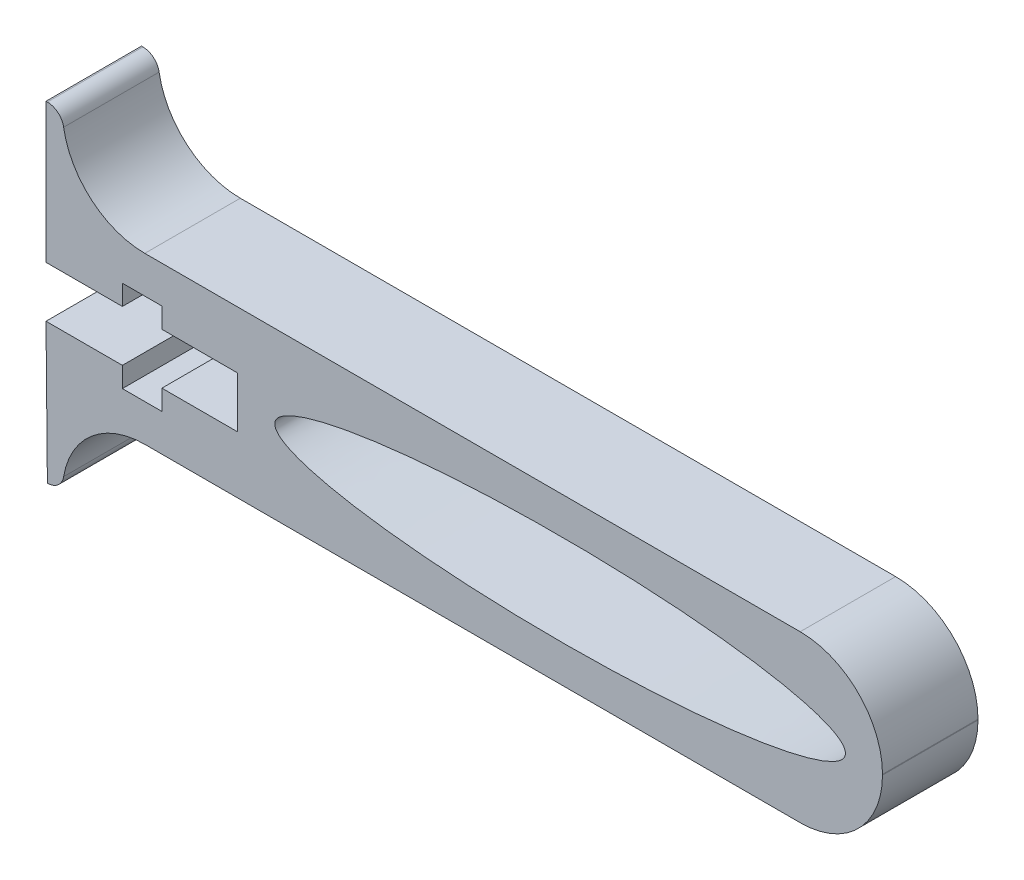
ISO-10303-21;
HEADER;
FILE_DESCRIPTION(('STEP AP214'),'2;1');
FILE_NAME('part.step','',(''),(''),'','','');
FILE_SCHEMA(('AUTOMOTIVE_DESIGN { 1 0 10303 214 1 1 1 1 }'));
ENDSEC;
DATA;
#1=APPLICATION_CONTEXT('core data for automotive mechanical design processes');
#2=APPLICATION_PROTOCOL_DEFINITION('international standard','automotive_design',2000,#1);
#3=PRODUCT_CONTEXT('',#1,'mechanical');
#4=PRODUCT('Part','Part','',(#3));
#5=PRODUCT_RELATED_PRODUCT_CATEGORY('part','',(#4));
#6=PRODUCT_DEFINITION_FORMATION('','',#4);
#7=PRODUCT_DEFINITION_CONTEXT('part definition',#1,'design');
#8=PRODUCT_DEFINITION('design','',#6,#7);
#9=PRODUCT_DEFINITION_SHAPE('','',#8);
#10=(LENGTH_UNIT() NAMED_UNIT(*) SI_UNIT(.MILLI.,.METRE.));
#11=(NAMED_UNIT(*) PLANE_ANGLE_UNIT() SI_UNIT($,.RADIAN.));
#12=(NAMED_UNIT(*) SI_UNIT($,.STERADIAN.) SOLID_ANGLE_UNIT());
#13=UNCERTAINTY_MEASURE_WITH_UNIT(LENGTH_MEASURE(1.E-05),#10,'distance_accuracy_value','');
#14=(GEOMETRIC_REPRESENTATION_CONTEXT(3) GLOBAL_UNCERTAINTY_ASSIGNED_CONTEXT((#13)) GLOBAL_UNIT_ASSIGNED_CONTEXT((#10,
#11,#12)) REPRESENTATION_CONTEXT('',''));
#15=CARTESIAN_POINT('',(0.,0.,0.));
#16=DIRECTION('',(0.,0.,1.));
#17=DIRECTION('',(1.,0.,0.));
#18=AXIS2_PLACEMENT_3D('',#15,#16,#17);
#19=CARTESIAN_POINT('',(-17.0141354369794,35.6066821471283,5.8));
#20=DIRECTION('',(0.,0.,-1.));
#21=DIRECTION('',(-1.,0.,0.));
#22=AXIS2_PLACEMENT_3D('',#19,#20,#21);
#23=PLANE('',#22);
#24=DIRECTION('',(0.,1.,0.));
#25=VECTOR('',#24,1.);
#26=CARTESIAN_POINT('',(-12.4598506262596,29.3566821471283,5.8));
#27=LINE('',#26,#25);
#28=CARTESIAN_POINT('',(-12.4598506262596,28.1322801349897,5.8));
#29=VERTEX_POINT('',#28);
#30=CARTESIAN_POINT('',(-12.4598506262596,29.3566821471283,5.8));
#31=VERTEX_POINT('',#30);
#32=EDGE_CURVE('E264',#29,#31,#27,.T.);
#33=ORIENTED_EDGE('',*,*,#32,.T.);
#34=DIRECTION('',(1.,0.,0.));
#35=VECTOR('',#34,1.);
#36=CARTESIAN_POINT('',(-10.0598506262596,29.3566821471283,5.8));
#37=LINE('',#36,#35);
#38=CARTESIAN_POINT('',(-10.0598506262596,29.3566821471283,5.8));
#39=VERTEX_POINT('',#38);
#40=EDGE_CURVE('E137',#31,#39,#37,.T.);
#41=ORIENTED_EDGE('',*,*,#40,.T.);
#42=DIRECTION('',(0.,-1.,0.));
#43=VECTOR('',#42,1.);
#44=CARTESIAN_POINT('',(-10.0598506262596,29.3566821471283,5.8));
#45=LINE('',#44,#43);
#46=CARTESIAN_POINT('',(-10.0598506262596,28.1322801349897,5.8));
#47=VERTEX_POINT('',#46);
#48=EDGE_CURVE('E324',#39,#47,#45,.T.);
#49=ORIENTED_EDGE('',*,*,#48,.T.);
#50=DIRECTION('',(1.,0.,0.));
#51=VECTOR('',#50,1.);
#52=CARTESIAN_POINT('',(-10.0598506262596,28.1322801349897,5.8));
#53=LINE('',#52,#51);
#54=CARTESIAN_POINT('',(-5.45496555029504,28.1322801349897,5.8));
#55=VERTEX_POINT('',#54);
#56=EDGE_CURVE('E343',#47,#55,#53,.T.);
#57=ORIENTED_EDGE('',*,*,#56,.T.);
#58=DIRECTION('',(0.,-1.,0.));
#59=VECTOR('',#58,1.);
#60=CARTESIAN_POINT('',(-5.45496555029504,25.0366001234286,5.8));
#61=LINE('',#60,#59);
#62=CARTESIAN_POINT('',(-5.45496555029504,25.0366001234286,5.8));
#63=VERTEX_POINT('',#62);
#64=EDGE_CURVE('E340',#55,#63,#61,.T.);
#65=ORIENTED_EDGE('',*,*,#64,.T.);
#66=DIRECTION('',(-1.,0.,0.));
#67=VECTOR('',#66,1.);
#68=CARTESIAN_POINT('',(-10.0598506262596,25.0366001234286,5.8));
#69=LINE('',#68,#67);
#70=CARTESIAN_POINT('',(-10.0598506262596,25.0366001234286,5.8));
#71=VERTEX_POINT('',#70);
#72=EDGE_CURVE('E342',#63,#71,#69,.T.);
#73=ORIENTED_EDGE('',*,*,#72,.T.);
#74=DIRECTION('',(0.,-1.,0.));
#75=VECTOR('',#74,1.);
#76=CARTESIAN_POINT('',(-10.0598506262596,25.0366001234286,5.8));
#77=LINE('',#76,#75);
#78=CARTESIAN_POINT('',(-10.0598506262596,23.8121981112899,5.8));
#79=VERTEX_POINT('',#78);
#80=EDGE_CURVE('E345',#71,#79,#77,.T.);
#81=ORIENTED_EDGE('',*,*,#80,.T.);
#82=DIRECTION('',(-1.,0.,0.));
#83=VECTOR('',#82,1.);
#84=CARTESIAN_POINT('',(-10.0598506262596,23.8121981112899,5.8));
#85=LINE('',#84,#83);
#86=CARTESIAN_POINT('',(-12.4598506262596,23.8121981112899,5.8));
#87=VERTEX_POINT('',#86);
#88=EDGE_CURVE('E351',#79,#87,#85,.T.);
#89=ORIENTED_EDGE('',*,*,#88,.T.);
#90=DIRECTION('',(0.,1.,0.));
#91=VECTOR('',#90,1.);
#92=CARTESIAN_POINT('',(-12.4598506262596,25.0366001234286,5.8));
#93=LINE('',#92,#91);
#94=CARTESIAN_POINT('',(-12.4598506262596,25.0366001234286,5.8));
#95=VERTEX_POINT('',#94);
#96=EDGE_CURVE('E353',#87,#95,#93,.T.);
#97=ORIENTED_EDGE('',*,*,#96,.T.);
#98=DIRECTION('',(-1.,0.,0.));
#99=VECTOR('',#98,1.);
#100=CARTESIAN_POINT('',(-12.4598506262596,25.0366001234286,5.8));
#101=LINE('',#100,#99);
#102=CARTESIAN_POINT('',(-17.0980556538798,25.0366001234286,5.8));
#103=VERTEX_POINT('',#102);
#104=EDGE_CURVE('E355',#95,#103,#101,.T.);
#105=ORIENTED_EDGE('',*,*,#104,.T.);
#106=DIRECTION('',(0.00990230369705596,-0.999950970988824,0.));
#107=VECTOR('',#106,1.);
#108=CARTESIAN_POINT('',(-17.0141354369794,16.5621981112899,5.8));
#109=LINE('',#108,#107);
#110=CARTESIAN_POINT('',(-17.0141354369794,16.5621981112899,5.8));
#111=VERTEX_POINT('',#110);
#112=EDGE_CURVE('E357',#103,#111,#109,.T.);
#113=ORIENTED_EDGE('',*,*,#112,.T.);
#114=CARTESIAN_POINT('',(-17.0141354369794,17.5621981112899,5.8));
#115=DIRECTION('',(0.,0.,1.));
#116=DIRECTION('',(1.,0.,0.));
#117=AXIS2_PLACEMENT_3D('',#114,#115,#116);
#118=CIRCLE('',#117,1.);
#119=CARTESIAN_POINT('',(-16.0281221397962,17.3955314446233,5.8));
#120=VERTEX_POINT('',#119);
#121=EDGE_CURVE('E359',#111,#120,#118,.T.);
#122=ORIENTED_EDGE('',*,*,#121,.T.);
#123=CARTESIAN_POINT('',(-11.0980556538798,16.5621981112899,5.8));
#124=DIRECTION('',(0.,0.,-1.));
#125=DIRECTION('',(-1.,0.,0.));
#126=AXIS2_PLACEMENT_3D('',#123,#124,#125);
#127=CIRCLE('',#126,5.);
#128=CARTESIAN_POINT('',(-11.0980556538798,21.56219811129,5.8));
#129=VERTEX_POINT('',#128);
#130=EDGE_CURVE('E361',#120,#129,#127,.T.);
#131=ORIENTED_EDGE('',*,*,#130,.T.);
#132=DIRECTION('',(1.,0.,0.));
#133=VECTOR('',#132,1.);
#134=CARTESIAN_POINT('',(28.7019443461202,21.56219811129,5.8));
#135=LINE('',#134,#133);
#136=CARTESIAN_POINT('',(28.7019443461202,21.56219811129,5.8));
#137=VERTEX_POINT('',#136);
#138=EDGE_CURVE('E363',#129,#137,#135,.T.);
#139=ORIENTED_EDGE('',*,*,#138,.T.);
#140=CARTESIAN_POINT('',(28.7019443461202,26.56219811129,5.8));
#141=DIRECTION('',(0.,0.,1.));
#142=DIRECTION('',(1.,0.,0.));
#143=AXIS2_PLACEMENT_3D('',#140,#141,#142);
#144=CIRCLE('',#143,4.99999999999999);
#145=CARTESIAN_POINT('',(33.7019443461202,26.56219811129,5.8));
#146=VERTEX_POINT('',#145);
#147=EDGE_CURVE('E365',#137,#146,#144,.T.);
#148=ORIENTED_EDGE('',*,*,#147,.T.);
#149=DIRECTION('',(0.,1.,0.));
#150=VECTOR('',#149,1.);
#151=CARTESIAN_POINT('',(33.7019443461202,26.6066821471283,5.8));
#152=LINE('',#151,#150);
#153=CARTESIAN_POINT('',(33.7019443461202,26.6066821471283,5.8));
#154=VERTEX_POINT('',#153);
#155=EDGE_CURVE('E367',#146,#154,#152,.T.);
#156=ORIENTED_EDGE('',*,*,#155,.T.);
#157=CARTESIAN_POINT('',(28.7019443461202,26.6066821471283,5.8));
#158=DIRECTION('',(0.,0.,1.));
#159=DIRECTION('',(-1.,0.,0.));
#160=AXIS2_PLACEMENT_3D('',#157,#158,#159);
#161=CIRCLE('',#160,4.99999999999999);
#162=CARTESIAN_POINT('',(28.7019443461202,31.6066821471283,5.8));
#163=VERTEX_POINT('',#162);
#164=EDGE_CURVE('E369',#154,#163,#161,.T.);
#165=ORIENTED_EDGE('',*,*,#164,.T.);
#166=DIRECTION('',(-1.,0.,0.));
#167=VECTOR('',#166,1.);
#168=CARTESIAN_POINT('',(-11.0980556538798,31.6066821471283,5.8));
#169=LINE('',#168,#167);
#170=CARTESIAN_POINT('',(-11.0980556538798,31.6066821471283,5.8));
#171=VERTEX_POINT('',#170);
#172=EDGE_CURVE('E371',#163,#171,#169,.T.);
#173=ORIENTED_EDGE('',*,*,#172,.T.);
#174=CARTESIAN_POINT('',(-11.0980556538798,36.6066821471283,5.8));
#175=DIRECTION('',(0.,0.,-1.));
#176=DIRECTION('',(1.,0.,0.));
#177=AXIS2_PLACEMENT_3D('',#174,#175,#176);
#178=CIRCLE('',#177,5.);
#179=CARTESIAN_POINT('',(-16.0281221397962,35.773348813795,5.8));
#180=VERTEX_POINT('',#179);
#181=EDGE_CURVE('E373',#171,#180,#178,.T.);
#182=ORIENTED_EDGE('',*,*,#181,.T.);
#183=CARTESIAN_POINT('',(-17.0141354369794,35.6066821471283,5.8));
#184=DIRECTION('',(0.,0.,1.));
#185=DIRECTION('',(-1.,0.,0.));
#186=AXIS2_PLACEMENT_3D('',#183,#184,#185);
#187=CIRCLE('',#186,1.);
#188=CARTESIAN_POINT('',(-17.0141354369794,36.6066821471283,5.8));
#189=VERTEX_POINT('',#188);
#190=EDGE_CURVE('E201',#180,#189,#187,.T.);
#191=ORIENTED_EDGE('',*,*,#190,.T.);
#192=DIRECTION('',(-1.,0.,0.));
#193=VECTOR('',#192,1.);
#194=CARTESIAN_POINT('',(-17.0980556538798,36.6066821471283,5.8));
#195=LINE('',#194,#193);
#196=CARTESIAN_POINT('',(-17.0980556538798,36.6066821471283,5.8));
#197=VERTEX_POINT('',#196);
#198=EDGE_CURVE('E195',#189,#197,#195,.T.);
#199=ORIENTED_EDGE('',*,*,#198,.T.);
#200=DIRECTION('',(0.,-1.,0.));
#201=VECTOR('',#200,1.);
#202=CARTESIAN_POINT('',(-17.0980556538798,28.1322801349897,5.8));
#203=LINE('',#202,#201);
#204=CARTESIAN_POINT('',(-17.0980556538798,28.1322801349897,5.8));
#205=VERTEX_POINT('',#204);
#206=EDGE_CURVE('E199',#197,#205,#203,.T.);
#207=ORIENTED_EDGE('',*,*,#206,.T.);
#208=DIRECTION('',(1.,0.,0.));
#209=VECTOR('',#208,1.);
#210=CARTESIAN_POINT('',(-17.0980556538798,28.1322801349897,5.8));
#211=LINE('',#210,#209);
#212=EDGE_CURVE('E49',#205,#29,#211,.T.);
#213=ORIENTED_EDGE('',*,*,#212,.T.);
#214=EDGE_LOOP('',(#33,#41,#49,#57,#65,#73,#81,#89,#97,#105,#113,#122,#131,#139,#148,#156,#165,
#173,#182,#191,#199,#207,#213));
#215=FACE_BOUND('',#214,.T.);
#216=CARTESIAN_POINT('',(14.1234893979126,26.5844401292091,5.8));
#217=DIRECTION('',(0.,0.,1.));
#218=DIRECTION('',(-1.,0.,0.));
#219=AXIS2_PLACEMENT_3D('',#216,#217,#218);
#220=ELLIPSE('',#219,17.3284549482076,2.7722420179192);
#221=CARTESIAN_POINT('',(-3.20496555029504,26.5844401292091,5.8));
#222=VERTEX_POINT('',#221);
#223=EDGE_CURVE('E223',#222,#222,#220,.T.);
#224=ORIENTED_EDGE('',*,*,#223,.F.);
#225=EDGE_LOOP('',(#224));
#226=FACE_BOUND('',#225,.T.);
#227=ADVANCED_FACE('F32',(#215,#226),#23,.F.);
#228=CARTESIAN_POINT('',(-17.0141354369794,35.6066821471283,0.));
#229=DIRECTION('',(0.,0.,-1.));
#230=DIRECTION('',(-1.,0.,0.));
#231=AXIS2_PLACEMENT_3D('',#228,#229,#230);
#232=PLANE('',#231);
#233=DIRECTION('',(0.,1.,0.));
#234=VECTOR('',#233,1.);
#235=CARTESIAN_POINT('',(-12.4598506262596,29.3566821471283,0.));
#236=LINE('',#235,#234);
#237=CARTESIAN_POINT('',(-12.4598506262596,28.1322801349897,0.));
#238=VERTEX_POINT('',#237);
#239=CARTESIAN_POINT('',(-12.4598506262596,29.3566821471283,0.));
#240=VERTEX_POINT('',#239);
#241=EDGE_CURVE('E219',#238,#240,#236,.T.);
#242=ORIENTED_EDGE('',*,*,#241,.F.);
#243=DIRECTION('',(1.,0.,0.));
#244=VECTOR('',#243,1.);
#245=CARTESIAN_POINT('',(-17.0980556538798,28.1322801349897,0.));
#246=LINE('',#245,#244);
#247=CARTESIAN_POINT('',(-17.0980556538798,28.1322801349897,0.));
#248=VERTEX_POINT('',#247);
#249=EDGE_CURVE('E129',#248,#238,#246,.T.);
#250=ORIENTED_EDGE('',*,*,#249,.F.);
#251=DIRECTION('',(0.,-1.,0.));
#252=VECTOR('',#251,1.);
#253=CARTESIAN_POINT('',(-17.0980556538798,28.1322801349897,0.));
#254=LINE('',#253,#252);
#255=CARTESIAN_POINT('',(-17.0980556538798,36.6066821471283,0.));
#256=VERTEX_POINT('',#255);
#257=EDGE_CURVE('E123',#256,#248,#254,.T.);
#258=ORIENTED_EDGE('',*,*,#257,.F.);
#259=DIRECTION('',(-1.,0.,0.));
#260=VECTOR('',#259,1.);
#261=CARTESIAN_POINT('',(-17.0980556538798,36.6066821471283,0.));
#262=LINE('',#261,#260);
#263=CARTESIAN_POINT('',(-17.0141354369794,36.6066821471283,0.));
#264=VERTEX_POINT('',#263);
#265=EDGE_CURVE('E209',#264,#256,#262,.T.);
#266=ORIENTED_EDGE('',*,*,#265,.F.);
#267=CARTESIAN_POINT('',(-17.0141354369794,35.6066821471283,0.));
#268=DIRECTION('',(0.,0.,1.));
#269=DIRECTION('',(-1.,0.,0.));
#270=AXIS2_PLACEMENT_3D('',#267,#268,#269);
#271=CIRCLE('',#270,1.);
#272=CARTESIAN_POINT('',(-16.0281221397962,35.773348813795,0.));
#273=VERTEX_POINT('',#272);
#274=EDGE_CURVE('E259',#273,#264,#271,.T.);
#275=ORIENTED_EDGE('',*,*,#274,.F.);
#276=CARTESIAN_POINT('',(-11.0980556538798,36.6066821471283,0.));
#277=DIRECTION('',(0.,0.,-1.));
#278=DIRECTION('',(1.,0.,0.));
#279=AXIS2_PLACEMENT_3D('',#276,#277,#278);
#280=CIRCLE('',#279,5.);
#281=CARTESIAN_POINT('',(-11.0980556538798,31.6066821471283,0.));
#282=VERTEX_POINT('',#281);
#283=EDGE_CURVE('E257',#282,#273,#280,.T.);
#284=ORIENTED_EDGE('',*,*,#283,.F.);
#285=DIRECTION('',(-1.,0.,0.));
#286=VECTOR('',#285,1.);
#287=CARTESIAN_POINT('',(-11.0980556538798,31.6066821471283,0.));
#288=LINE('',#287,#286);
#289=CARTESIAN_POINT('',(28.7019443461202,31.6066821471283,0.));
#290=VERTEX_POINT('',#289);
#291=EDGE_CURVE('E255',#290,#282,#288,.T.);
#292=ORIENTED_EDGE('',*,*,#291,.F.);
#293=CARTESIAN_POINT('',(28.7019443461202,26.6066821471283,0.));
#294=DIRECTION('',(0.,0.,1.));
#295=DIRECTION('',(-1.,0.,0.));
#296=AXIS2_PLACEMENT_3D('',#293,#294,#295);
#297=CIRCLE('',#296,4.99999999999999);
#298=CARTESIAN_POINT('',(33.7019443461202,26.6066821471283,0.));
#299=VERTEX_POINT('',#298);
#300=EDGE_CURVE('E253',#299,#290,#297,.T.);
#301=ORIENTED_EDGE('',*,*,#300,.F.);
#302=DIRECTION('',(0.,1.,0.));
#303=VECTOR('',#302,1.);
#304=CARTESIAN_POINT('',(33.7019443461202,26.6066821471283,0.));
#305=LINE('',#304,#303);
#306=CARTESIAN_POINT('',(33.7019443461202,26.56219811129,0.));
#307=VERTEX_POINT('',#306);
#308=EDGE_CURVE('E251',#307,#299,#305,.T.);
#309=ORIENTED_EDGE('',*,*,#308,.F.);
#310=CARTESIAN_POINT('',(28.7019443461202,26.56219811129,0.));
#311=DIRECTION('',(0.,0.,1.));
#312=DIRECTION('',(1.,0.,0.));
#313=AXIS2_PLACEMENT_3D('',#310,#311,#312);
#314=CIRCLE('',#313,4.99999999999999);
#315=CARTESIAN_POINT('',(28.7019443461202,21.56219811129,0.));
#316=VERTEX_POINT('',#315);
#317=EDGE_CURVE('E249',#316,#307,#314,.T.);
#318=ORIENTED_EDGE('',*,*,#317,.F.);
#319=DIRECTION('',(1.,0.,0.));
#320=VECTOR('',#319,1.);
#321=CARTESIAN_POINT('',(28.7019443461202,21.56219811129,0.));
#322=LINE('',#321,#320);
#323=CARTESIAN_POINT('',(-11.0980556538798,21.56219811129,0.));
#324=VERTEX_POINT('',#323);
#325=EDGE_CURVE('E247',#324,#316,#322,.T.);
#326=ORIENTED_EDGE('',*,*,#325,.F.);
#327=CARTESIAN_POINT('',(-11.0980556538798,16.5621981112899,0.));
#328=DIRECTION('',(0.,0.,-1.));
#329=DIRECTION('',(-1.,0.,0.));
#330=AXIS2_PLACEMENT_3D('',#327,#328,#329);
#331=CIRCLE('',#330,5.);
#332=CARTESIAN_POINT('',(-16.0281221397962,17.3955314446233,0.));
#333=VERTEX_POINT('',#332);
#334=EDGE_CURVE('E245',#333,#324,#331,.T.);
#335=ORIENTED_EDGE('',*,*,#334,.F.);
#336=CARTESIAN_POINT('',(-17.0141354369794,17.5621981112899,0.));
#337=DIRECTION('',(0.,0.,1.));
#338=DIRECTION('',(1.,0.,0.));
#339=AXIS2_PLACEMENT_3D('',#336,#337,#338);
#340=CIRCLE('',#339,1.);
#341=CARTESIAN_POINT('',(-17.0141354369794,16.5621981112899,0.));
#342=VERTEX_POINT('',#341);
#343=EDGE_CURVE('E243',#342,#333,#340,.T.);
#344=ORIENTED_EDGE('',*,*,#343,.F.);
#345=DIRECTION('',(0.00990230369705596,-0.999950970988824,0.));
#346=VECTOR('',#345,1.);
#347=CARTESIAN_POINT('',(-17.0141354369794,16.5621981112899,0.));
#348=LINE('',#347,#346);
#349=CARTESIAN_POINT('',(-17.0980556538798,25.0366001234286,0.));
#350=VERTEX_POINT('',#349);
#351=EDGE_CURVE('E241',#350,#342,#348,.T.);
#352=ORIENTED_EDGE('',*,*,#351,.F.);
#353=DIRECTION('',(-1.,0.,0.));
#354=VECTOR('',#353,1.);
#355=CARTESIAN_POINT('',(-12.4598506262596,25.0366001234286,0.));
#356=LINE('',#355,#354);
#357=CARTESIAN_POINT('',(-12.4598506262596,25.0366001234286,0.));
#358=VERTEX_POINT('',#357);
#359=EDGE_CURVE('E239',#358,#350,#356,.T.);
#360=ORIENTED_EDGE('',*,*,#359,.F.);
#361=DIRECTION('',(0.,1.,0.));
#362=VECTOR('',#361,1.);
#363=CARTESIAN_POINT('',(-12.4598506262596,25.0366001234286,0.));
#364=LINE('',#363,#362);
#365=CARTESIAN_POINT('',(-12.4598506262596,23.8121981112899,0.));
#366=VERTEX_POINT('',#365);
#367=EDGE_CURVE('E237',#366,#358,#364,.T.);
#368=ORIENTED_EDGE('',*,*,#367,.F.);
#369=DIRECTION('',(-1.,0.,0.));
#370=VECTOR('',#369,1.);
#371=CARTESIAN_POINT('',(-10.0598506262596,23.8121981112899,0.));
#372=LINE('',#371,#370);
#373=CARTESIAN_POINT('',(-10.0598506262596,23.8121981112899,0.));
#374=VERTEX_POINT('',#373);
#375=EDGE_CURVE('E235',#374,#366,#372,.T.);
#376=ORIENTED_EDGE('',*,*,#375,.F.);
#377=DIRECTION('',(0.,-1.,0.));
#378=VECTOR('',#377,1.);
#379=CARTESIAN_POINT('',(-10.0598506262596,25.0366001234286,0.));
#380=LINE('',#379,#378);
#381=CARTESIAN_POINT('',(-10.0598506262596,25.0366001234286,0.));
#382=VERTEX_POINT('',#381);
#383=EDGE_CURVE('E233',#382,#374,#380,.T.);
#384=ORIENTED_EDGE('',*,*,#383,.F.);
#385=DIRECTION('',(-1.,0.,0.));
#386=VECTOR('',#385,1.);
#387=CARTESIAN_POINT('',(-10.0598506262596,25.0366001234286,0.));
#388=LINE('',#387,#386);
#389=CARTESIAN_POINT('',(-5.45496555029504,25.0366001234286,0.));
#390=VERTEX_POINT('',#389);
#391=EDGE_CURVE('E231',#390,#382,#388,.T.);
#392=ORIENTED_EDGE('',*,*,#391,.F.);
#393=DIRECTION('',(0.,-1.,0.));
#394=VECTOR('',#393,1.);
#395=CARTESIAN_POINT('',(-5.45496555029504,25.0366001234286,0.));
#396=LINE('',#395,#394);
#397=CARTESIAN_POINT('',(-5.45496555029504,28.1322801349897,0.));
#398=VERTEX_POINT('',#397);
#399=EDGE_CURVE('E229',#398,#390,#396,.T.);
#400=ORIENTED_EDGE('',*,*,#399,.F.);
#401=DIRECTION('',(1.,0.,0.));
#402=VECTOR('',#401,1.);
#403=CARTESIAN_POINT('',(-10.0598506262596,28.1322801349897,0.));
#404=LINE('',#403,#402);
#405=CARTESIAN_POINT('',(-10.0598506262596,28.1322801349897,0.));
#406=VERTEX_POINT('',#405);
#407=EDGE_CURVE('E227',#406,#398,#404,.T.);
#408=ORIENTED_EDGE('',*,*,#407,.F.);
#409=DIRECTION('',(0.,-1.,0.));
#410=VECTOR('',#409,1.);
#411=CARTESIAN_POINT('',(-10.0598506262596,29.3566821471283,0.));
#412=LINE('',#411,#410);
#413=CARTESIAN_POINT('',(-10.0598506262596,29.3566821471283,0.));
#414=VERTEX_POINT('',#413);
#415=EDGE_CURVE('E225',#414,#406,#412,.T.);
#416=ORIENTED_EDGE('',*,*,#415,.F.);
#417=DIRECTION('',(1.,0.,0.));
#418=VECTOR('',#417,1.);
#419=CARTESIAN_POINT('',(-10.0598506262596,29.3566821471283,0.));
#420=LINE('',#419,#418);
#421=EDGE_CURVE('E222',#240,#414,#420,.T.);
#422=ORIENTED_EDGE('',*,*,#421,.F.);
#423=EDGE_LOOP('',(#242,#250,#258,#266,#275,#284,#292,#301,#309,#318,#326,#335,#344,#352,#360,
#368,#376,#384,#392,#400,#408,#416,#422));
#424=FACE_BOUND('',#423,.T.);
#425=CARTESIAN_POINT('',(14.1234893979126,26.5844401292091,0.));
#426=DIRECTION('',(0.,0.,1.));
#427=DIRECTION('',(-1.,0.,0.));
#428=AXIS2_PLACEMENT_3D('',#425,#426,#427);
#429=ELLIPSE('',#428,17.3284549482076,2.7722420179192);
#430=CARTESIAN_POINT('',(-3.20496555029504,26.5844401292091,0.));
#431=VERTEX_POINT('',#430);
#432=EDGE_CURVE('E408',#431,#431,#429,.T.);
#433=ORIENTED_EDGE('',*,*,#432,.T.);
#434=EDGE_LOOP('',(#433));
#435=FACE_BOUND('',#434,.T.);
#436=ADVANCED_FACE('F328',(#424,#435),#232,.T.);
#437=CARTESIAN_POINT('',(-12.4598506262596,29.3566821471283,5.8));
#438=DIRECTION('',(-1.,0.,0.));
#439=DIRECTION('',(0.,0.,1.));
#440=AXIS2_PLACEMENT_3D('',#437,#438,#439);
#441=PLANE('',#440);
#442=ORIENTED_EDGE('',*,*,#241,.T.);
#443=DIRECTION('',(0.,0.,-1.));
#444=VECTOR('',#443,1.);
#445=CARTESIAN_POINT('',(-12.4598506262596,29.3566821471283,5.8));
#446=LINE('',#445,#444);
#447=EDGE_CURVE('E11',#31,#240,#446,.T.);
#448=ORIENTED_EDGE('',*,*,#447,.F.);
#449=ORIENTED_EDGE('',*,*,#32,.F.);
#450=DIRECTION('',(0.,0.,-1.));
#451=VECTOR('',#450,1.);
#452=CARTESIAN_POINT('',(-12.4598506262596,28.1322801349897,5.8));
#453=LINE('',#452,#451);
#454=EDGE_CURVE('E215',#29,#238,#453,.T.);
#455=ORIENTED_EDGE('',*,*,#454,.T.);
#456=EDGE_LOOP('',(#442,#448,#449,#455));
#457=FACE_BOUND('',#456,.T.);
#458=ADVANCED_FACE('F34',(#457),#441,.F.);
#459=CARTESIAN_POINT('',(-10.0598506262596,29.3566821471283,5.8));
#460=DIRECTION('',(0.,1.,0.));
#461=DIRECTION('',(-1.,0.,0.));
#462=AXIS2_PLACEMENT_3D('',#459,#460,#461);
#463=PLANE('',#462);
#464=ORIENTED_EDGE('',*,*,#421,.T.);
#465=DIRECTION('',(0.,0.,-1.));
#466=VECTOR('',#465,1.);
#467=CARTESIAN_POINT('',(-10.0598506262596,29.3566821471283,5.8));
#468=LINE('',#467,#466);
#469=EDGE_CURVE('E41',#39,#414,#468,.T.);
#470=ORIENTED_EDGE('',*,*,#469,.F.);
#471=ORIENTED_EDGE('',*,*,#40,.F.);
#472=ORIENTED_EDGE('',*,*,#447,.T.);
#473=EDGE_LOOP('',(#464,#470,#471,#472));
#474=FACE_BOUND('',#473,.T.);
#475=ADVANCED_FACE('F418',(#474),#463,.F.);
#476=CARTESIAN_POINT('',(-10.0598506262596,29.3566821471283,5.8));
#477=DIRECTION('',(1.,0.,0.));
#478=DIRECTION('',(0.,1.,0.));
#479=AXIS2_PLACEMENT_3D('',#476,#477,#478);
#480=PLANE('',#479);
#481=ORIENTED_EDGE('',*,*,#415,.T.);
#482=DIRECTION('',(0.,0.,-1.));
#483=VECTOR('',#482,1.);
#484=CARTESIAN_POINT('',(-10.0598506262596,28.1322801349897,5.8));
#485=LINE('',#484,#483);
#486=EDGE_CURVE('E316',#47,#406,#485,.T.);
#487=ORIENTED_EDGE('',*,*,#486,.F.);
#488=ORIENTED_EDGE('',*,*,#48,.F.);
#489=ORIENTED_EDGE('',*,*,#469,.T.);
#490=EDGE_LOOP('',(#481,#487,#488,#489));
#491=FACE_BOUND('',#490,.T.);
#492=ADVANCED_FACE('F322',(#491),#480,.F.);
#493=CARTESIAN_POINT('',(-10.0598506262596,28.1322801349897,5.8));
#494=DIRECTION('',(0.,1.,0.));
#495=DIRECTION('',(-1.,0.,0.));
#496=AXIS2_PLACEMENT_3D('',#493,#494,#495);
#497=PLANE('',#496);
#498=ORIENTED_EDGE('',*,*,#407,.T.);
#499=DIRECTION('',(0.,0.,-1.));
#500=VECTOR('',#499,1.);
#501=CARTESIAN_POINT('',(-5.45496555029504,28.1322801349897,5.8));
#502=LINE('',#501,#500);
#503=EDGE_CURVE('E313',#55,#398,#502,.T.);
#504=ORIENTED_EDGE('',*,*,#503,.F.);
#505=ORIENTED_EDGE('',*,*,#56,.F.);
#506=ORIENTED_EDGE('',*,*,#486,.T.);
#507=EDGE_LOOP('',(#498,#504,#505,#506));
#508=FACE_BOUND('',#507,.T.);
#509=ADVANCED_FACE('F334',(#508),#497,.F.);
#510=CARTESIAN_POINT('',(-5.45496555029504,25.0366001234286,5.8));
#511=DIRECTION('',(1.,0.,0.));
#512=DIRECTION('',(0.,0.,-1.));
#513=AXIS2_PLACEMENT_3D('',#510,#511,#512);
#514=PLANE('',#513);
#515=ORIENTED_EDGE('',*,*,#399,.T.);
#516=DIRECTION('',(0.,0.,-1.));
#517=VECTOR('',#516,1.);
#518=CARTESIAN_POINT('',(-5.45496555029504,25.0366001234286,5.8));
#519=LINE('',#518,#517);
#520=EDGE_CURVE('E310',#63,#390,#519,.T.);
#521=ORIENTED_EDGE('',*,*,#520,.F.);
#522=ORIENTED_EDGE('',*,*,#64,.F.);
#523=ORIENTED_EDGE('',*,*,#503,.T.);
#524=EDGE_LOOP('',(#515,#521,#522,#523));
#525=FACE_BOUND('',#524,.T.);
#526=ADVANCED_FACE('F338',(#525),#514,.F.);
#527=CARTESIAN_POINT('',(-10.0598506262596,25.0366001234286,5.8));
#528=DIRECTION('',(0.,-1.,0.));
#529=DIRECTION('',(1.,0.,0.));
#530=AXIS2_PLACEMENT_3D('',#527,#528,#529);
#531=PLANE('',#530);
#532=ORIENTED_EDGE('',*,*,#391,.T.);
#533=DIRECTION('',(0.,0.,-1.));
#534=VECTOR('',#533,1.);
#535=CARTESIAN_POINT('',(-10.0598506262596,25.0366001234286,5.8));
#536=LINE('',#535,#534);
#537=EDGE_CURVE('E307',#71,#382,#536,.T.);
#538=ORIENTED_EDGE('',*,*,#537,.F.);
#539=ORIENTED_EDGE('',*,*,#72,.F.);
#540=ORIENTED_EDGE('',*,*,#520,.T.);
#541=EDGE_LOOP('',(#532,#538,#539,#540));
#542=FACE_BOUND('',#541,.T.);
#543=ADVANCED_FACE('F431',(#542),#531,.F.);
#544=CARTESIAN_POINT('',(-10.0598506262596,25.0366001234286,5.8));
#545=DIRECTION('',(1.,0.,0.));
#546=DIRECTION('',(0.,1.,0.));
#547=AXIS2_PLACEMENT_3D('',#544,#545,#546);
#548=PLANE('',#547);
#549=ORIENTED_EDGE('',*,*,#383,.T.);
#550=DIRECTION('',(0.,0.,-1.));
#551=VECTOR('',#550,1.);
#552=CARTESIAN_POINT('',(-10.0598506262596,23.8121981112899,5.8));
#553=LINE('',#552,#551);
#554=EDGE_CURVE('E304',#79,#374,#553,.T.);
#555=ORIENTED_EDGE('',*,*,#554,.F.);
#556=ORIENTED_EDGE('',*,*,#80,.F.);
#557=ORIENTED_EDGE('',*,*,#537,.T.);
#558=EDGE_LOOP('',(#549,#555,#556,#557));
#559=FACE_BOUND('',#558,.T.);
#560=ADVANCED_FACE('F434',(#559),#548,.F.);
#561=CARTESIAN_POINT('',(-10.0598506262596,23.8121981112899,5.8));
#562=DIRECTION('',(0.,-1.,0.));
#563=DIRECTION('',(1.,0.,0.));
#564=AXIS2_PLACEMENT_3D('',#561,#562,#563);
#565=PLANE('',#564);
#566=ORIENTED_EDGE('',*,*,#375,.T.);
#567=DIRECTION('',(0.,0.,-1.));
#568=VECTOR('',#567,1.);
#569=CARTESIAN_POINT('',(-12.4598506262596,23.8121981112899,5.8));
#570=LINE('',#569,#568);
#571=EDGE_CURVE('E301',#87,#366,#570,.T.);
#572=ORIENTED_EDGE('',*,*,#571,.F.);
#573=ORIENTED_EDGE('',*,*,#88,.F.);
#574=ORIENTED_EDGE('',*,*,#554,.T.);
#575=EDGE_LOOP('',(#566,#572,#573,#574));
#576=FACE_BOUND('',#575,.T.);
#577=ADVANCED_FACE('F438',(#576),#565,.F.);
#578=CARTESIAN_POINT('',(-12.4598506262596,25.0366001234286,5.8));
#579=DIRECTION('',(-1.,0.,0.));
#580=DIRECTION('',(0.,0.,1.));
#581=AXIS2_PLACEMENT_3D('',#578,#579,#580);
#582=PLANE('',#581);
#583=ORIENTED_EDGE('',*,*,#367,.T.);
#584=DIRECTION('',(0.,0.,-1.));
#585=VECTOR('',#584,1.);
#586=CARTESIAN_POINT('',(-12.4598506262596,25.0366001234286,5.8));
#587=LINE('',#586,#585);
#588=EDGE_CURVE('E298',#95,#358,#587,.T.);
#589=ORIENTED_EDGE('',*,*,#588,.F.);
#590=ORIENTED_EDGE('',*,*,#96,.F.);
#591=ORIENTED_EDGE('',*,*,#571,.T.);
#592=EDGE_LOOP('',(#583,#589,#590,#591));
#593=FACE_BOUND('',#592,.T.);
#594=ADVANCED_FACE('F442',(#593),#582,.F.);
#595=CARTESIAN_POINT('',(-12.4598506262596,25.0366001234286,5.8));
#596=DIRECTION('',(0.,-1.,0.));
#597=DIRECTION('',(1.,0.,0.));
#598=AXIS2_PLACEMENT_3D('',#595,#596,#597);
#599=PLANE('',#598);
#600=ORIENTED_EDGE('',*,*,#359,.T.);
#601=DIRECTION('',(0.,0.,-1.));
#602=VECTOR('',#601,1.);
#603=CARTESIAN_POINT('',(-17.0980556538798,25.0366001234286,5.8));
#604=LINE('',#603,#602);
#605=EDGE_CURVE('E295',#103,#350,#604,.T.);
#606=ORIENTED_EDGE('',*,*,#605,.F.);
#607=ORIENTED_EDGE('',*,*,#104,.F.);
#608=ORIENTED_EDGE('',*,*,#588,.T.);
#609=EDGE_LOOP('',(#600,#606,#607,#608));
#610=FACE_BOUND('',#609,.T.);
#611=ADVANCED_FACE('F446',(#610),#599,.F.);
#612=CARTESIAN_POINT('',(-17.0141354369794,16.5621981112899,5.8));
#613=DIRECTION('',(0.999950970988824,0.00990230369705596,0.));
#614=DIRECTION('',(-0.00990230369705596,0.999950970988824,0.));
#615=AXIS2_PLACEMENT_3D('',#612,#613,#614);
#616=PLANE('',#615);
#617=ORIENTED_EDGE('',*,*,#351,.T.);
#618=DIRECTION('',(0.,0.,-1.));
#619=VECTOR('',#618,1.);
#620=CARTESIAN_POINT('',(-17.0141354369794,16.5621981112899,5.8));
#621=LINE('',#620,#619);
#622=EDGE_CURVE('E292',#111,#342,#621,.T.);
#623=ORIENTED_EDGE('',*,*,#622,.F.);
#624=ORIENTED_EDGE('',*,*,#112,.F.);
#625=ORIENTED_EDGE('',*,*,#605,.T.);
#626=EDGE_LOOP('',(#617,#623,#624,#625));
#627=FACE_BOUND('',#626,.T.);
#628=ADVANCED_FACE('F450',(#627),#616,.F.);
#629=CARTESIAN_POINT('',(-17.0141354369794,17.5621981112899,5.8));
#630=DIRECTION('',(0.,0.,-1.));
#631=DIRECTION('',(-1.,0.,0.));
#632=AXIS2_PLACEMENT_3D('',#629,#630,#631);
#633=CYLINDRICAL_SURFACE('',#632,1.);
#634=ORIENTED_EDGE('',*,*,#343,.T.);
#635=DIRECTION('',(0.,0.,-1.));
#636=VECTOR('',#635,1.);
#637=CARTESIAN_POINT('',(-16.0281221397962,17.3955314446233,5.8));
#638=LINE('',#637,#636);
#639=EDGE_CURVE('E289',#120,#333,#638,.T.);
#640=ORIENTED_EDGE('',*,*,#639,.F.);
#641=ORIENTED_EDGE('',*,*,#121,.F.);
#642=ORIENTED_EDGE('',*,*,#622,.T.);
#643=EDGE_LOOP('',(#634,#640,#641,#642));
#644=FACE_BOUND('',#643,.T.);
#645=ADVANCED_FACE('F454',(#644),#633,.T.);
#646=CARTESIAN_POINT('',(-11.0980556538798,16.5621981112899,5.8));
#647=DIRECTION('',(0.,0.,-1.));
#648=DIRECTION('',(-1.,0.,0.));
#649=AXIS2_PLACEMENT_3D('',#646,#647,#648);
#650=CYLINDRICAL_SURFACE('',#649,5.);
#651=ORIENTED_EDGE('',*,*,#334,.T.);
#652=DIRECTION('',(0.,0.,-1.));
#653=VECTOR('',#652,1.);
#654=CARTESIAN_POINT('',(-11.0980556538798,21.56219811129,5.8));
#655=LINE('',#654,#653);
#656=EDGE_CURVE('E286',#129,#324,#655,.T.);
#657=ORIENTED_EDGE('',*,*,#656,.F.);
#658=ORIENTED_EDGE('',*,*,#130,.F.);
#659=ORIENTED_EDGE('',*,*,#639,.T.);
#660=EDGE_LOOP('',(#651,#657,#658,#659));
#661=FACE_BOUND('',#660,.T.);
#662=ADVANCED_FACE('F458',(#661),#650,.F.);
#663=CARTESIAN_POINT('',(28.7019443461202,21.56219811129,5.8));
#664=DIRECTION('',(0.,1.,0.));
#665=DIRECTION('',(-1.,0.,0.));
#666=AXIS2_PLACEMENT_3D('',#663,#664,#665);
#667=PLANE('',#666);
#668=ORIENTED_EDGE('',*,*,#325,.T.);
#669=DIRECTION('',(0.,0.,-1.));
#670=VECTOR('',#669,1.);
#671=CARTESIAN_POINT('',(28.7019443461202,21.56219811129,5.8));
#672=LINE('',#671,#670);
#673=EDGE_CURVE('E283',#137,#316,#672,.T.);
#674=ORIENTED_EDGE('',*,*,#673,.F.);
#675=ORIENTED_EDGE('',*,*,#138,.F.);
#676=ORIENTED_EDGE('',*,*,#656,.T.);
#677=EDGE_LOOP('',(#668,#674,#675,#676));
#678=FACE_BOUND('',#677,.T.);
#679=ADVANCED_FACE('F462',(#678),#667,.F.);
#680=CARTESIAN_POINT('',(28.7019443461202,26.56219811129,5.8));
#681=DIRECTION('',(0.,0.,-1.));
#682=DIRECTION('',(-1.,0.,0.));
#683=AXIS2_PLACEMENT_3D('',#680,#681,#682);
#684=CYLINDRICAL_SURFACE('',#683,4.99999999999999);
#685=ORIENTED_EDGE('',*,*,#317,.T.);
#686=DIRECTION('',(0.,0.,-1.));
#687=VECTOR('',#686,1.);
#688=CARTESIAN_POINT('',(33.7019443461202,26.56219811129,5.8));
#689=LINE('',#688,#687);
#690=EDGE_CURVE('E280',#146,#307,#689,.T.);
#691=ORIENTED_EDGE('',*,*,#690,.F.);
#692=ORIENTED_EDGE('',*,*,#147,.F.);
#693=ORIENTED_EDGE('',*,*,#673,.T.);
#694=EDGE_LOOP('',(#685,#691,#692,#693));
#695=FACE_BOUND('',#694,.T.);
#696=ADVANCED_FACE('F466',(#695),#684,.T.);
#697=CARTESIAN_POINT('',(33.7019443461202,26.6066821471283,5.8));
#698=DIRECTION('',(-1.,0.,0.));
#699=DIRECTION('',(0.,0.,1.));
#700=AXIS2_PLACEMENT_3D('',#697,#698,#699);
#701=PLANE('',#700);
#702=ORIENTED_EDGE('',*,*,#308,.T.);
#703=DIRECTION('',(0.,0.,-1.));
#704=VECTOR('',#703,1.);
#705=CARTESIAN_POINT('',(33.7019443461202,26.6066821471283,5.8));
#706=LINE('',#705,#704);
#707=EDGE_CURVE('E277',#154,#299,#706,.T.);
#708=ORIENTED_EDGE('',*,*,#707,.F.);
#709=ORIENTED_EDGE('',*,*,#155,.F.);
#710=ORIENTED_EDGE('',*,*,#690,.T.);
#711=EDGE_LOOP('',(#702,#708,#709,#710));
#712=FACE_BOUND('',#711,.T.);
#713=ADVANCED_FACE('F470',(#712),#701,.F.);
#714=CARTESIAN_POINT('',(28.7019443461202,26.6066821471283,5.8));
#715=DIRECTION('',(0.,0.,-1.));
#716=DIRECTION('',(-1.,0.,0.));
#717=AXIS2_PLACEMENT_3D('',#714,#715,#716);
#718=CYLINDRICAL_SURFACE('',#717,4.99999999999999);
#719=ORIENTED_EDGE('',*,*,#300,.T.);
#720=DIRECTION('',(0.,0.,-1.));
#721=VECTOR('',#720,1.);
#722=CARTESIAN_POINT('',(28.7019443461202,31.6066821471283,5.8));
#723=LINE('',#722,#721);
#724=EDGE_CURVE('E274',#163,#290,#723,.T.);
#725=ORIENTED_EDGE('',*,*,#724,.F.);
#726=ORIENTED_EDGE('',*,*,#164,.F.);
#727=ORIENTED_EDGE('',*,*,#707,.T.);
#728=EDGE_LOOP('',(#719,#725,#726,#727));
#729=FACE_BOUND('',#728,.T.);
#730=ADVANCED_FACE('F474',(#729),#718,.T.);
#731=CARTESIAN_POINT('',(-11.0980556538798,31.6066821471283,5.8));
#732=DIRECTION('',(0.,-1.,0.));
#733=DIRECTION('',(1.,0.,0.));
#734=AXIS2_PLACEMENT_3D('',#731,#732,#733);
#735=PLANE('',#734);
#736=ORIENTED_EDGE('',*,*,#291,.T.);
#737=DIRECTION('',(0.,0.,-1.));
#738=VECTOR('',#737,1.);
#739=CARTESIAN_POINT('',(-11.0980556538798,31.6066821471283,5.8));
#740=LINE('',#739,#738);
#741=EDGE_CURVE('E271',#171,#282,#740,.T.);
#742=ORIENTED_EDGE('',*,*,#741,.F.);
#743=ORIENTED_EDGE('',*,*,#172,.F.);
#744=ORIENTED_EDGE('',*,*,#724,.T.);
#745=EDGE_LOOP('',(#736,#742,#743,#744));
#746=FACE_BOUND('',#745,.T.);
#747=ADVANCED_FACE('F478',(#746),#735,.F.);
#748=CARTESIAN_POINT('',(-11.0980556538798,36.6066821471283,5.8));
#749=DIRECTION('',(0.,0.,-1.));
#750=DIRECTION('',(-1.,0.,0.));
#751=AXIS2_PLACEMENT_3D('',#748,#749,#750);
#752=CYLINDRICAL_SURFACE('',#751,5.);
#753=ORIENTED_EDGE('',*,*,#283,.T.);
#754=DIRECTION('',(0.,0.,-1.));
#755=VECTOR('',#754,1.);
#756=CARTESIAN_POINT('',(-16.0281221397962,35.773348813795,5.8));
#757=LINE('',#756,#755);
#758=EDGE_CURVE('E268',#180,#273,#757,.T.);
#759=ORIENTED_EDGE('',*,*,#758,.F.);
#760=ORIENTED_EDGE('',*,*,#181,.F.);
#761=ORIENTED_EDGE('',*,*,#741,.T.);
#762=EDGE_LOOP('',(#753,#759,#760,#761));
#763=FACE_BOUND('',#762,.T.);
#764=ADVANCED_FACE('F379',(#763),#752,.F.);
#765=CARTESIAN_POINT('',(-17.0141354369794,35.6066821471283,5.8));
#766=DIRECTION('',(0.,0.,-1.));
#767=DIRECTION('',(-1.,0.,0.));
#768=AXIS2_PLACEMENT_3D('',#765,#766,#767);
#769=CYLINDRICAL_SURFACE('',#768,1.);
#770=ORIENTED_EDGE('',*,*,#274,.T.);
#771=DIRECTION('',(0.,0.,-1.));
#772=VECTOR('',#771,1.);
#773=CARTESIAN_POINT('',(-17.0141354369794,36.6066821471283,5.8));
#774=LINE('',#773,#772);
#775=EDGE_CURVE('E210',#189,#264,#774,.T.);
#776=ORIENTED_EDGE('',*,*,#775,.F.);
#777=ORIENTED_EDGE('',*,*,#190,.F.);
#778=ORIENTED_EDGE('',*,*,#758,.T.);
#779=EDGE_LOOP('',(#770,#776,#777,#778));
#780=FACE_BOUND('',#779,.T.);
#781=ADVANCED_FACE('F383',(#780),#769,.T.);
#782=CARTESIAN_POINT('',(-17.0980556538798,36.6066821471283,5.8));
#783=DIRECTION('',(0.,-1.,0.));
#784=DIRECTION('',(0.,0.,-1.));
#785=AXIS2_PLACEMENT_3D('',#782,#783,#784);
#786=PLANE('',#785);
#787=ORIENTED_EDGE('',*,*,#265,.T.);
#788=DIRECTION('',(0.,0.,-1.));
#789=VECTOR('',#788,1.);
#790=CARTESIAN_POINT('',(-17.0980556538798,36.6066821471283,5.8));
#791=LINE('',#790,#789);
#792=EDGE_CURVE('E206',#197,#256,#791,.T.);
#793=ORIENTED_EDGE('',*,*,#792,.F.);
#794=ORIENTED_EDGE('',*,*,#198,.F.);
#795=ORIENTED_EDGE('',*,*,#775,.T.);
#796=EDGE_LOOP('',(#787,#793,#794,#795));
#797=FACE_BOUND('',#796,.T.);
#798=ADVANCED_FACE('F207',(#797),#786,.F.);
#799=CARTESIAN_POINT('',(-17.0980556538798,28.1322801349897,5.8));
#800=DIRECTION('',(1.,0.,0.));
#801=DIRECTION('',(0.,0.,-1.));
#802=AXIS2_PLACEMENT_3D('',#799,#800,#801);
#803=PLANE('',#802);
#804=ORIENTED_EDGE('',*,*,#257,.T.);
#805=DIRECTION('',(0.,0.,-1.));
#806=VECTOR('',#805,1.);
#807=CARTESIAN_POINT('',(-17.0980556538798,28.1322801349897,5.8));
#808=LINE('',#807,#806);
#809=EDGE_CURVE('E211',#205,#248,#808,.T.);
#810=ORIENTED_EDGE('',*,*,#809,.F.);
#811=ORIENTED_EDGE('',*,*,#206,.F.);
#812=ORIENTED_EDGE('',*,*,#792,.T.);
#813=EDGE_LOOP('',(#804,#810,#811,#812));
#814=FACE_BOUND('',#813,.T.);
#815=ADVANCED_FACE('F213',(#814),#803,.F.);
#816=CARTESIAN_POINT('',(-17.0980556538798,28.1322801349897,5.8));
#817=DIRECTION('',(0.,1.,0.));
#818=DIRECTION('',(-1.,0.,0.));
#819=AXIS2_PLACEMENT_3D('',#816,#817,#818);
#820=PLANE('',#819);
#821=ORIENTED_EDGE('',*,*,#249,.T.);
#822=ORIENTED_EDGE('',*,*,#454,.F.);
#823=ORIENTED_EDGE('',*,*,#212,.F.);
#824=ORIENTED_EDGE('',*,*,#809,.T.);
#825=EDGE_LOOP('',(#821,#822,#823,#824));
#826=FACE_BOUND('',#825,.T.);
#827=ADVANCED_FACE('F387',(#826),#820,.F.);
#828=DIRECTION('',(0.,0.,-1.));
#829=VECTOR('',#828,1.);
#830=SURFACE_OF_LINEAR_EXTRUSION('',#220,#829);
#831=ORIENTED_EDGE('',*,*,#223,.T.);
#832=EDGE_LOOP('',(#831));
#833=FACE_BOUND('',#832,.T.);
#834=ORIENTED_EDGE('',*,*,#432,.F.);
#835=EDGE_LOOP('',(#834));
#836=FACE_BOUND('',#835,.T.);
#837=ADVANCED_FACE('F389',(#833,#836),#830,.T.);
#838=CLOSED_SHELL('',(#227,#436,#458,#475,#492,#509,#526,#543,#560,#577,#594,#611,#628,#645,
#662,#679,#696,#713,#730,#747,#764,#781,#798,#815,#827,#837));
#839=MANIFOLD_SOLID_BREP('B2',#838);
#840=ADVANCED_BREP_SHAPE_REPRESENTATION('',(#18,#839),#14);
#841=SHAPE_DEFINITION_REPRESENTATION(#9,#840);
ENDSEC;
END-ISO-10303-21;
